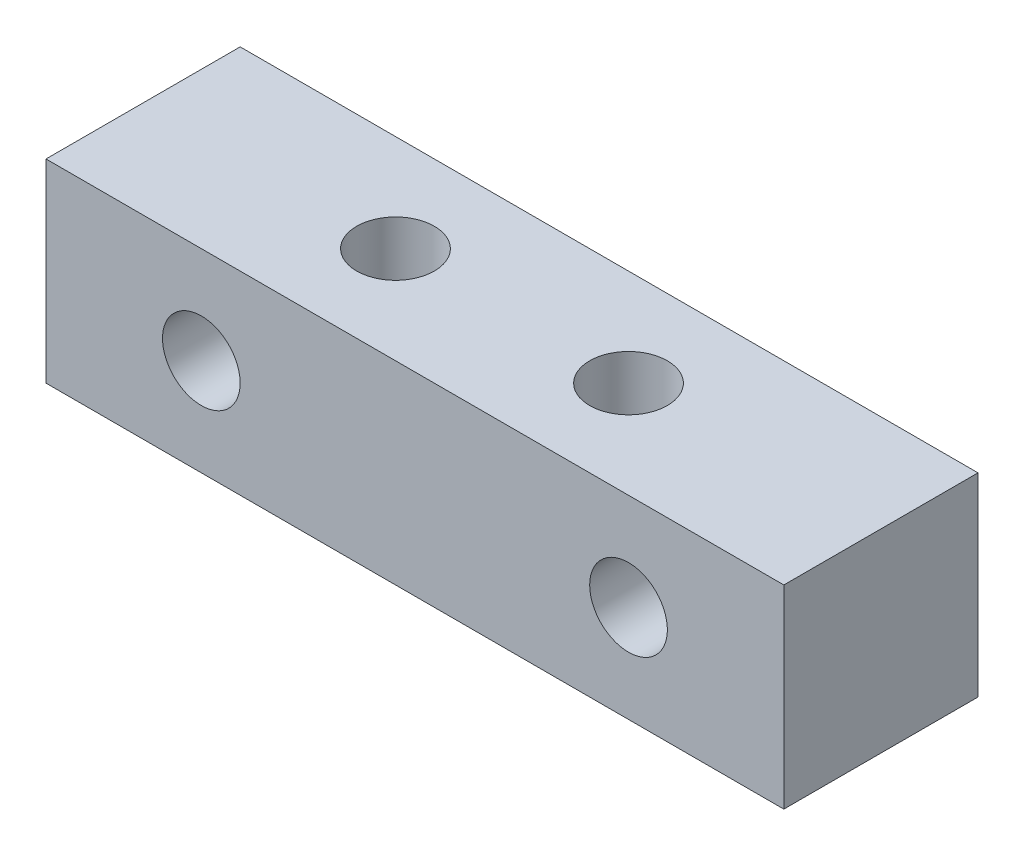
ISO-10303-21;
HEADER;
FILE_DESCRIPTION(('STEP AP214'),'2;1');
FILE_NAME('part.step','',(''),(''),'','','');
FILE_SCHEMA(('AUTOMOTIVE_DESIGN { 1 0 10303 214 1 1 1 1 }'));
ENDSEC;
DATA;
#1=APPLICATION_CONTEXT('core data for automotive mechanical design processes');
#2=APPLICATION_PROTOCOL_DEFINITION('international standard','automotive_design',2000,#1);
#3=PRODUCT_CONTEXT('',#1,'mechanical');
#4=PRODUCT('Part','Part','',(#3));
#5=PRODUCT_RELATED_PRODUCT_CATEGORY('part','',(#4));
#6=PRODUCT_DEFINITION_FORMATION('','',#4);
#7=PRODUCT_DEFINITION_CONTEXT('part definition',#1,'design');
#8=PRODUCT_DEFINITION('design','',#6,#7);
#9=PRODUCT_DEFINITION_SHAPE('','',#8);
#10=(LENGTH_UNIT() NAMED_UNIT(*) SI_UNIT(.MILLI.,.METRE.));
#11=(NAMED_UNIT(*) PLANE_ANGLE_UNIT() SI_UNIT($,.RADIAN.));
#12=(NAMED_UNIT(*) SI_UNIT($,.STERADIAN.) SOLID_ANGLE_UNIT());
#13=UNCERTAINTY_MEASURE_WITH_UNIT(LENGTH_MEASURE(1.E-05),#10,'distance_accuracy_value','');
#14=(GEOMETRIC_REPRESENTATION_CONTEXT(3) GLOBAL_UNCERTAINTY_ASSIGNED_CONTEXT((#13)) GLOBAL_UNIT_ASSIGNED_CONTEXT((#10,
#11,#12)) REPRESENTATION_CONTEXT('',''));
#15=CARTESIAN_POINT('',(0.,0.,0.));
#16=DIRECTION('',(0.,0.,1.));
#17=DIRECTION('',(1.,0.,0.));
#18=AXIS2_PLACEMENT_3D('',#15,#16,#17);
#19=CARTESIAN_POINT('',(19.,-5.,10.));
#20=DIRECTION('',(-1.,0.,0.));
#21=DIRECTION('',(0.,0.,1.));
#22=AXIS2_PLACEMENT_3D('',#19,#20,#21);
#23=PLANE('',#22);
#24=DIRECTION('',(0.,1.,0.));
#25=VECTOR('',#24,1.);
#26=CARTESIAN_POINT('',(19.,-5.,0.));
#27=LINE('',#26,#25);
#28=CARTESIAN_POINT('',(19.,-5.,0.));
#29=VERTEX_POINT('',#28);
#30=CARTESIAN_POINT('',(19.,5.,0.));
#31=VERTEX_POINT('',#30);
#32=EDGE_CURVE('E102',#29,#31,#27,.T.);
#33=ORIENTED_EDGE('',*,*,#32,.T.);
#34=DIRECTION('',(0.,0.,-1.));
#35=VECTOR('',#34,1.);
#36=CARTESIAN_POINT('',(19.,5.,10.));
#37=LINE('',#36,#35);
#38=CARTESIAN_POINT('',(19.,5.,10.));
#39=VERTEX_POINT('',#38);
#40=EDGE_CURVE('E11',#39,#31,#37,.T.);
#41=ORIENTED_EDGE('',*,*,#40,.F.);
#42=DIRECTION('',(0.,1.,0.));
#43=VECTOR('',#42,1.);
#44=CARTESIAN_POINT('',(19.,-5.,10.));
#45=LINE('',#44,#43);
#46=CARTESIAN_POINT('',(19.,-5.,10.));
#47=VERTEX_POINT('',#46);
#48=EDGE_CURVE('E90',#47,#39,#45,.T.);
#49=ORIENTED_EDGE('',*,*,#48,.F.);
#50=DIRECTION('',(0.,0.,-1.));
#51=VECTOR('',#50,1.);
#52=CARTESIAN_POINT('',(19.,-5.,10.));
#53=LINE('',#52,#51);
#54=EDGE_CURVE('E98',#47,#29,#53,.T.);
#55=ORIENTED_EDGE('',*,*,#54,.T.);
#56=EDGE_LOOP('',(#33,#41,#49,#55));
#57=FACE_BOUND('',#56,.T.);
#58=ADVANCED_FACE('F39',(#57),#23,.F.);
#59=CARTESIAN_POINT('',(-19.,5.,10.));
#60=DIRECTION('',(0.,-1.,0.));
#61=DIRECTION('',(0.,0.,-1.));
#62=AXIS2_PLACEMENT_3D('',#59,#60,#61);
#63=PLANE('',#62);
#64=CARTESIAN_POINT('',(-6.,5.,5.));
#65=DIRECTION('',(0.,1.,0.));
#66=DIRECTION('',(0.,0.,1.));
#67=AXIS2_PLACEMENT_3D('',#64,#65,#66);
#68=CIRCLE('',#67,2.);
#69=CARTESIAN_POINT('',(-6.,5.,7.));
#70=VERTEX_POINT('',#69);
#71=EDGE_CURVE('E134',#70,#70,#68,.T.);
#72=ORIENTED_EDGE('',*,*,#71,.F.);
#73=EDGE_LOOP('',(#72));
#74=FACE_BOUND('',#73,.T.);
#75=CARTESIAN_POINT('',(6.,5.,5.));
#76=DIRECTION('',(0.,1.,0.));
#77=DIRECTION('',(0.,0.,-1.));
#78=AXIS2_PLACEMENT_3D('',#75,#76,#77);
#79=CIRCLE('',#78,2.);
#80=CARTESIAN_POINT('',(6.,5.,3.));
#81=VERTEX_POINT('',#80);
#82=EDGE_CURVE('E128',#81,#81,#79,.T.);
#83=ORIENTED_EDGE('',*,*,#82,.F.);
#84=EDGE_LOOP('',(#83));
#85=FACE_BOUND('',#84,.T.);
#86=DIRECTION('',(-1.,0.,0.));
#87=VECTOR('',#86,1.);
#88=CARTESIAN_POINT('',(-19.,5.,0.));
#89=LINE('',#88,#87);
#90=CARTESIAN_POINT('',(-19.,5.,0.));
#91=VERTEX_POINT('',#90);
#92=EDGE_CURVE('E94',#31,#91,#89,.T.);
#93=ORIENTED_EDGE('',*,*,#92,.T.);
#94=DIRECTION('',(0.,0.,-1.));
#95=VECTOR('',#94,1.);
#96=CARTESIAN_POINT('',(-19.,5.,10.));
#97=LINE('',#96,#95);
#98=CARTESIAN_POINT('',(-19.,5.,10.));
#99=VERTEX_POINT('',#98);
#100=EDGE_CURVE('E47',#99,#91,#97,.T.);
#101=ORIENTED_EDGE('',*,*,#100,.F.);
#102=DIRECTION('',(-1.,0.,0.));
#103=VECTOR('',#102,1.);
#104=CARTESIAN_POINT('',(-19.,5.,10.));
#105=LINE('',#104,#103);
#106=EDGE_CURVE('E85',#39,#99,#105,.T.);
#107=ORIENTED_EDGE('',*,*,#106,.F.);
#108=ORIENTED_EDGE('',*,*,#40,.T.);
#109=EDGE_LOOP('',(#93,#101,#107,#108));
#110=FACE_BOUND('',#109,.T.);
#111=ADVANCED_FACE('F93',(#74,#85,#110),#63,.F.);
#112=CARTESIAN_POINT('',(-19.,-5.,10.));
#113=DIRECTION('',(1.,0.,0.));
#114=DIRECTION('',(0.,0.,-1.));
#115=AXIS2_PLACEMENT_3D('',#112,#113,#114);
#116=PLANE('',#115);
#117=DIRECTION('',(0.,-1.,0.));
#118=VECTOR('',#117,1.);
#119=CARTESIAN_POINT('',(-19.,-5.,0.));
#120=LINE('',#119,#118);
#121=CARTESIAN_POINT('',(-19.,-5.,0.));
#122=VERTEX_POINT('',#121);
#123=EDGE_CURVE('E72',#91,#122,#120,.T.);
#124=ORIENTED_EDGE('',*,*,#123,.T.);
#125=DIRECTION('',(0.,0.,-1.));
#126=VECTOR('',#125,1.);
#127=CARTESIAN_POINT('',(-19.,-5.,10.));
#128=LINE('',#127,#126);
#129=CARTESIAN_POINT('',(-19.,-5.,10.));
#130=VERTEX_POINT('',#129);
#131=EDGE_CURVE('E95',#130,#122,#128,.T.);
#132=ORIENTED_EDGE('',*,*,#131,.F.);
#133=DIRECTION('',(0.,-1.,0.));
#134=VECTOR('',#133,1.);
#135=CARTESIAN_POINT('',(-19.,-5.,10.));
#136=LINE('',#135,#134);
#137=EDGE_CURVE('E88',#99,#130,#136,.T.);
#138=ORIENTED_EDGE('',*,*,#137,.F.);
#139=ORIENTED_EDGE('',*,*,#100,.T.);
#140=EDGE_LOOP('',(#124,#132,#138,#139));
#141=FACE_BOUND('',#140,.T.);
#142=ADVANCED_FACE('F96',(#141),#116,.F.);
#143=CARTESIAN_POINT('',(-19.,-5.,10.));
#144=DIRECTION('',(0.,1.,0.));
#145=DIRECTION('',(0.,0.,1.));
#146=AXIS2_PLACEMENT_3D('',#143,#144,#145);
#147=PLANE('',#146);
#148=CARTESIAN_POINT('',(-6.,-5.,5.));
#149=DIRECTION('',(0.,1.,0.));
#150=DIRECTION('',(0.,0.,1.));
#151=AXIS2_PLACEMENT_3D('',#148,#149,#150);
#152=CIRCLE('',#151,2.);
#153=CARTESIAN_POINT('',(-6.,-5.,7.));
#154=VERTEX_POINT('',#153);
#155=EDGE_CURVE('E120',#154,#154,#152,.T.);
#156=ORIENTED_EDGE('',*,*,#155,.T.);
#157=EDGE_LOOP('',(#156));
#158=FACE_BOUND('',#157,.T.);
#159=CARTESIAN_POINT('',(6.,-5.,5.));
#160=DIRECTION('',(0.,1.,0.));
#161=DIRECTION('',(0.,0.,-1.));
#162=AXIS2_PLACEMENT_3D('',#159,#160,#161);
#163=CIRCLE('',#162,2.);
#164=CARTESIAN_POINT('',(6.,-5.,3.));
#165=VERTEX_POINT('',#164);
#166=EDGE_CURVE('E131',#165,#165,#163,.T.);
#167=ORIENTED_EDGE('',*,*,#166,.T.);
#168=EDGE_LOOP('',(#167));
#169=FACE_BOUND('',#168,.T.);
#170=DIRECTION('',(1.,0.,0.));
#171=VECTOR('',#170,1.);
#172=CARTESIAN_POINT('',(-19.,-5.,0.));
#173=LINE('',#172,#171);
#174=EDGE_CURVE('E78',#122,#29,#173,.T.);
#175=ORIENTED_EDGE('',*,*,#174,.T.);
#176=ORIENTED_EDGE('',*,*,#54,.F.);
#177=DIRECTION('',(1.,0.,0.));
#178=VECTOR('',#177,1.);
#179=CARTESIAN_POINT('',(-19.,-5.,10.));
#180=LINE('',#179,#178);
#181=EDGE_CURVE('E55',#130,#47,#180,.T.);
#182=ORIENTED_EDGE('',*,*,#181,.F.);
#183=ORIENTED_EDGE('',*,*,#131,.T.);
#184=EDGE_LOOP('',(#175,#176,#182,#183));
#185=FACE_BOUND('',#184,.T.);
#186=ADVANCED_FACE('F110',(#158,#169,#185),#147,.F.);
#187=CARTESIAN_POINT('',(0.,0.,10.));
#188=DIRECTION('',(0.,0.,-1.));
#189=DIRECTION('',(-1.,0.,0.));
#190=AXIS2_PLACEMENT_3D('',#187,#188,#189);
#191=PLANE('',#190);
#192=CARTESIAN_POINT('',(-11.,0.,10.));
#193=DIRECTION('',(0.,0.,1.));
#194=DIRECTION('',(1.,0.,0.));
#195=AXIS2_PLACEMENT_3D('',#192,#193,#194);
#196=CIRCLE('',#195,2.);
#197=CARTESIAN_POINT('',(-9.,0.,10.));
#198=VERTEX_POINT('',#197);
#199=EDGE_CURVE('E123',#198,#198,#196,.T.);
#200=ORIENTED_EDGE('',*,*,#199,.F.);
#201=EDGE_LOOP('',(#200));
#202=FACE_BOUND('',#201,.T.);
#203=CARTESIAN_POINT('',(11.,0.,10.));
#204=DIRECTION('',(0.,0.,1.));
#205=DIRECTION('',(-1.,0.,0.));
#206=AXIS2_PLACEMENT_3D('',#203,#204,#205);
#207=CIRCLE('',#206,2.);
#208=CARTESIAN_POINT('',(9.,0.,10.));
#209=VERTEX_POINT('',#208);
#210=EDGE_CURVE('E116',#209,#209,#207,.T.);
#211=ORIENTED_EDGE('',*,*,#210,.F.);
#212=EDGE_LOOP('',(#211));
#213=FACE_BOUND('',#212,.T.);
#214=ORIENTED_EDGE('',*,*,#48,.T.);
#215=ORIENTED_EDGE('',*,*,#106,.T.);
#216=ORIENTED_EDGE('',*,*,#137,.T.);
#217=ORIENTED_EDGE('',*,*,#181,.T.);
#218=EDGE_LOOP('',(#214,#215,#216,#217));
#219=FACE_BOUND('',#218,.T.);
#220=ADVANCED_FACE('F86',(#202,#213,#219),#191,.F.);
#221=CARTESIAN_POINT('',(0.,0.,0.));
#222=DIRECTION('',(0.,0.,-1.));
#223=DIRECTION('',(-1.,0.,0.));
#224=AXIS2_PLACEMENT_3D('',#221,#222,#223);
#225=PLANE('',#224);
#226=CARTESIAN_POINT('',(-11.,0.,0.));
#227=DIRECTION('',(0.,0.,1.));
#228=DIRECTION('',(1.,0.,0.));
#229=AXIS2_PLACEMENT_3D('',#226,#227,#228);
#230=CIRCLE('',#229,2.);
#231=CARTESIAN_POINT('',(-9.,0.,0.));
#232=VERTEX_POINT('',#231);
#233=EDGE_CURVE('E105',#232,#232,#230,.T.);
#234=ORIENTED_EDGE('',*,*,#233,.T.);
#235=EDGE_LOOP('',(#234));
#236=FACE_BOUND('',#235,.T.);
#237=CARTESIAN_POINT('',(11.,0.,0.));
#238=DIRECTION('',(0.,0.,1.));
#239=DIRECTION('',(-1.,0.,0.));
#240=AXIS2_PLACEMENT_3D('',#237,#238,#239);
#241=CIRCLE('',#240,2.);
#242=CARTESIAN_POINT('',(9.,0.,0.));
#243=VERTEX_POINT('',#242);
#244=EDGE_CURVE('E119',#243,#243,#241,.T.);
#245=ORIENTED_EDGE('',*,*,#244,.T.);
#246=EDGE_LOOP('',(#245));
#247=FACE_BOUND('',#246,.T.);
#248=ORIENTED_EDGE('',*,*,#32,.F.);
#249=ORIENTED_EDGE('',*,*,#174,.F.);
#250=ORIENTED_EDGE('',*,*,#123,.F.);
#251=ORIENTED_EDGE('',*,*,#92,.F.);
#252=EDGE_LOOP('',(#248,#249,#250,#251));
#253=FACE_BOUND('',#252,.T.);
#254=ADVANCED_FACE('F113',(#236,#247,#253),#225,.T.);
#255=CARTESIAN_POINT('',(11.,0.,0.));
#256=DIRECTION('',(0.,0.,1.));
#257=DIRECTION('',(1.,0.,0.));
#258=AXIS2_PLACEMENT_3D('',#255,#256,#257);
#259=CYLINDRICAL_SURFACE('',#258,2.);
#260=ORIENTED_EDGE('',*,*,#244,.F.);
#261=EDGE_LOOP('',(#260));
#262=FACE_BOUND('',#261,.T.);
#263=ORIENTED_EDGE('',*,*,#210,.T.);
#264=EDGE_LOOP('',(#263));
#265=FACE_BOUND('',#264,.T.);
#266=ADVANCED_FACE('F161',(#262,#265),#259,.F.);
#267=CARTESIAN_POINT('',(-11.,0.,0.));
#268=DIRECTION('',(0.,0.,1.));
#269=DIRECTION('',(1.,0.,0.));
#270=AXIS2_PLACEMENT_3D('',#267,#268,#269);
#271=CYLINDRICAL_SURFACE('',#270,2.);
#272=ORIENTED_EDGE('',*,*,#233,.F.);
#273=EDGE_LOOP('',(#272));
#274=FACE_BOUND('',#273,.T.);
#275=ORIENTED_EDGE('',*,*,#199,.T.);
#276=EDGE_LOOP('',(#275));
#277=FACE_BOUND('',#276,.T.);
#278=ADVANCED_FACE('F154',(#274,#277),#271,.F.);
#279=CARTESIAN_POINT('',(6.,-5.,5.));
#280=DIRECTION('',(0.,1.,0.));
#281=DIRECTION('',(0.,0.,1.));
#282=AXIS2_PLACEMENT_3D('',#279,#280,#281);
#283=CYLINDRICAL_SURFACE('',#282,2.);
#284=ORIENTED_EDGE('',*,*,#166,.F.);
#285=EDGE_LOOP('',(#284));
#286=FACE_BOUND('',#285,.T.);
#287=ORIENTED_EDGE('',*,*,#82,.T.);
#288=EDGE_LOOP('',(#287));
#289=FACE_BOUND('',#288,.T.);
#290=ADVANCED_FACE('F145',(#286,#289),#283,.F.);
#291=CARTESIAN_POINT('',(-6.,-5.,5.));
#292=DIRECTION('',(0.,1.,0.));
#293=DIRECTION('',(0.,0.,1.));
#294=AXIS2_PLACEMENT_3D('',#291,#292,#293);
#295=CYLINDRICAL_SURFACE('',#294,2.);
#296=ORIENTED_EDGE('',*,*,#155,.F.);
#297=EDGE_LOOP('',(#296));
#298=FACE_BOUND('',#297,.T.);
#299=ORIENTED_EDGE('',*,*,#71,.T.);
#300=EDGE_LOOP('',(#299));
#301=FACE_BOUND('',#300,.T.);
#302=ADVANCED_FACE('F142',(#298,#301),#295,.F.);
#303=CLOSED_SHELL('',(#58,#111,#142,#186,#220,#254,#266,#278,#290,#302));
#304=MANIFOLD_SOLID_BREP('B2',#303);
#305=ADVANCED_BREP_SHAPE_REPRESENTATION('',(#18,#304),#14);
#306=SHAPE_DEFINITION_REPRESENTATION(#9,#305);
ENDSEC;
END-ISO-10303-21;
